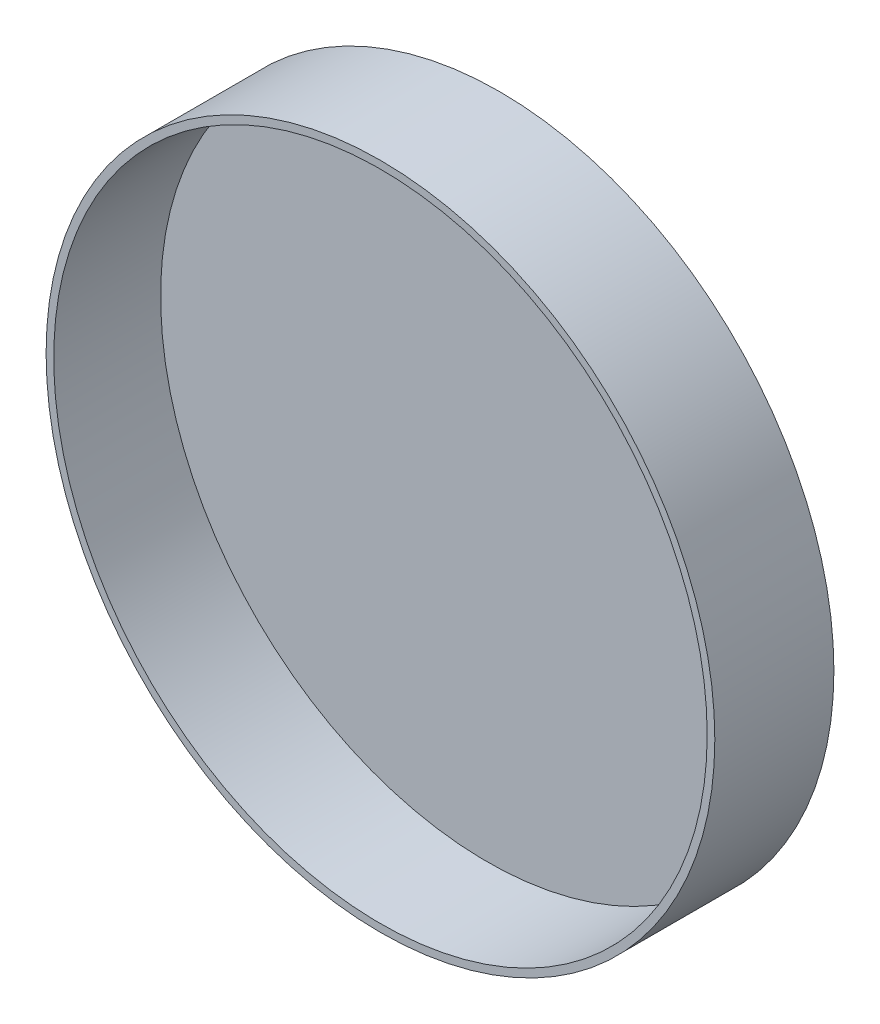
ISO-10303-21;
HEADER;
FILE_DESCRIPTION(('STEP AP214'),'2;1');
FILE_NAME('part.step','',(''),(''),'','','');
FILE_SCHEMA(('AUTOMOTIVE_DESIGN { 1 0 10303 214 1 1 1 1 }'));
ENDSEC;
DATA;
#1=APPLICATION_CONTEXT('core data for automotive mechanical design processes');
#2=APPLICATION_PROTOCOL_DEFINITION('international standard','automotive_design',2000,#1);
#3=PRODUCT_CONTEXT('',#1,'mechanical');
#4=PRODUCT('Part','Part','',(#3));
#5=PRODUCT_RELATED_PRODUCT_CATEGORY('part','',(#4));
#6=PRODUCT_DEFINITION_FORMATION('','',#4);
#7=PRODUCT_DEFINITION_CONTEXT('part definition',#1,'design');
#8=PRODUCT_DEFINITION('design','',#6,#7);
#9=PRODUCT_DEFINITION_SHAPE('','',#8);
#10=(LENGTH_UNIT() NAMED_UNIT(*) SI_UNIT(.MILLI.,.METRE.));
#11=(NAMED_UNIT(*) PLANE_ANGLE_UNIT() SI_UNIT($,.RADIAN.));
#12=(NAMED_UNIT(*) SI_UNIT($,.STERADIAN.) SOLID_ANGLE_UNIT());
#13=UNCERTAINTY_MEASURE_WITH_UNIT(LENGTH_MEASURE(1.E-05),#10,'distance_accuracy_value','');
#14=(GEOMETRIC_REPRESENTATION_CONTEXT(3) GLOBAL_UNCERTAINTY_ASSIGNED_CONTEXT((#13)) GLOBAL_UNIT_ASSIGNED_CONTEXT((#10,
#11,#12)) REPRESENTATION_CONTEXT('',''));
#15=CARTESIAN_POINT('',(0.,0.,0.));
#16=DIRECTION('',(0.,0.,1.));
#17=DIRECTION('',(1.,0.,0.));
#18=AXIS2_PLACEMENT_3D('',#15,#16,#17);
#19=CARTESIAN_POINT('',(0.,0.,0.8));
#20=DIRECTION('',(0.,0.,-1.));
#21=DIRECTION('',(-1.,0.,0.));
#22=AXIS2_PLACEMENT_3D('',#19,#20,#21);
#23=CYLINDRICAL_SURFACE('',#22,21.9);
#24=CARTESIAN_POINT('',(0.,0.,0.));
#25=DIRECTION('',(0.,0.,1.));
#26=DIRECTION('',(1.,0.,0.));
#27=AXIS2_PLACEMENT_3D('',#24,#25,#26);
#28=CIRCLE('',#27,21.9);
#29=CARTESIAN_POINT('',(21.9,0.,0.));
#30=VERTEX_POINT('',#29);
#31=EDGE_CURVE('E36',#30,#30,#28,.T.);
#32=ORIENTED_EDGE('',*,*,#31,.T.);
#33=EDGE_LOOP('',(#32));
#34=FACE_BOUND('',#33,.T.);
#35=CARTESIAN_POINT('',(0.,0.,7.8));
#36=DIRECTION('',(0.,0.,1.));
#37=DIRECTION('',(1.,0.,0.));
#38=AXIS2_PLACEMENT_3D('',#35,#36,#37);
#39=CIRCLE('',#38,21.9);
#40=CARTESIAN_POINT('',(21.9,0.,7.8));
#41=VERTEX_POINT('',#40);
#42=EDGE_CURVE('E40',#41,#41,#39,.T.);
#43=ORIENTED_EDGE('',*,*,#42,.F.);
#44=EDGE_LOOP('',(#43));
#45=FACE_BOUND('',#44,.T.);
#46=ADVANCED_FACE('F30',(#34,#45),#23,.T.);
#47=CARTESIAN_POINT('',(0.,0.,0.));
#48=DIRECTION('',(0.,0.,1.));
#49=DIRECTION('',(1.,0.,0.));
#50=AXIS2_PLACEMENT_3D('',#47,#48,#49);
#51=PLANE('',#50);
#52=CARTESIAN_POINT('',(0.,0.,0.));
#53=DIRECTION('',(0.,0.,1.));
#54=DIRECTION('',(1.,0.,0.));
#55=AXIS2_PLACEMENT_3D('',#52,#53,#54);
#56=CIRCLE('',#55,2.);
#57=CARTESIAN_POINT('',(2.,0.,0.));
#58=VERTEX_POINT('',#57);
#59=EDGE_CURVE('E49',#58,#58,#56,.T.);
#60=ORIENTED_EDGE('',*,*,#59,.T.);
#61=EDGE_LOOP('',(#60));
#62=FACE_BOUND('',#61,.T.);
#63=ORIENTED_EDGE('',*,*,#31,.F.);
#64=EDGE_LOOP('',(#63));
#65=FACE_BOUND('',#64,.T.);
#66=ADVANCED_FACE('F68',(#62,#65),#51,.F.);
#67=CARTESIAN_POINT('',(0.,0.,7.8));
#68=DIRECTION('',(0.,0.,1.));
#69=DIRECTION('',(1.,0.,0.));
#70=AXIS2_PLACEMENT_3D('',#67,#68,#69);
#71=PLANE('',#70);
#72=ORIENTED_EDGE('',*,*,#42,.T.);
#73=EDGE_LOOP('',(#72));
#74=FACE_BOUND('',#73,.T.);
#75=CARTESIAN_POINT('',(0.,0.,7.8));
#76=DIRECTION('',(0.,0.,1.));
#77=DIRECTION('',(1.,0.,0.));
#78=AXIS2_PLACEMENT_3D('',#75,#76,#77);
#79=CIRCLE('',#78,21.4);
#80=CARTESIAN_POINT('',(21.4,0.,7.8));
#81=VERTEX_POINT('',#80);
#82=EDGE_CURVE('E44',#81,#81,#79,.T.);
#83=ORIENTED_EDGE('',*,*,#82,.F.);
#84=EDGE_LOOP('',(#83));
#85=FACE_BOUND('',#84,.T.);
#86=ADVANCED_FACE('F72',(#74,#85),#71,.T.);
#87=CARTESIAN_POINT('',(0.,0.,7.8));
#88=DIRECTION('',(0.,0.,-1.));
#89=DIRECTION('',(-1.,0.,0.));
#90=AXIS2_PLACEMENT_3D('',#87,#88,#89);
#91=CYLINDRICAL_SURFACE('',#90,21.4);
#92=ORIENTED_EDGE('',*,*,#82,.T.);
#93=EDGE_LOOP('',(#92));
#94=FACE_BOUND('',#93,.T.);
#95=CARTESIAN_POINT('',(0.,0.,0.8));
#96=DIRECTION('',(0.,0.,1.));
#97=DIRECTION('',(1.,0.,0.));
#98=AXIS2_PLACEMENT_3D('',#95,#96,#97);
#99=CIRCLE('',#98,21.4);
#100=CARTESIAN_POINT('',(21.4,0.,0.8));
#101=VERTEX_POINT('',#100);
#102=EDGE_CURVE('E10',#101,#101,#99,.F.);
#103=ORIENTED_EDGE('',*,*,#102,.T.);
#104=EDGE_LOOP('',(#103));
#105=FACE_BOUND('',#104,.T.);
#106=ADVANCED_FACE('F79',(#94,#105),#91,.F.);
#107=CARTESIAN_POINT('',(0.,0.,0.8));
#108=DIRECTION('',(0.,0.,1.));
#109=DIRECTION('',(1.,0.,0.));
#110=AXIS2_PLACEMENT_3D('',#107,#108,#109);
#111=PLANE('',#110);
#112=ORIENTED_EDGE('',*,*,#102,.F.);
#113=EDGE_LOOP('',(#112));
#114=FACE_BOUND('',#113,.T.);
#115=ADVANCED_FACE('F65',(#114),#111,.T.);
#116=CARTESIAN_POINT('',(0.,0.,-9.2));
#117=DIRECTION('',(0.,0.,1.));
#118=DIRECTION('',(1.,0.,0.));
#119=AXIS2_PLACEMENT_3D('',#116,#117,#118);
#120=CYLINDRICAL_SURFACE('',#119,2.);
#121=CARTESIAN_POINT('',(0.,0.,-9.2));
#122=DIRECTION('',(0.,0.,1.));
#123=DIRECTION('',(1.,0.,0.));
#124=AXIS2_PLACEMENT_3D('',#121,#122,#123);
#125=CIRCLE('',#124,2.);
#126=CARTESIAN_POINT('',(2.,0.,-9.2));
#127=VERTEX_POINT('',#126);
#128=EDGE_CURVE('E52',#127,#127,#125,.T.);
#129=ORIENTED_EDGE('',*,*,#128,.T.);
#130=EDGE_LOOP('',(#129));
#131=FACE_BOUND('',#130,.T.);
#132=ORIENTED_EDGE('',*,*,#59,.F.);
#133=EDGE_LOOP('',(#132));
#134=FACE_BOUND('',#133,.T.);
#135=ADVANCED_FACE('F56',(#131,#134),#120,.T.);
#136=CARTESIAN_POINT('',(0.,0.,-9.2));
#137=DIRECTION('',(0.,0.,1.));
#138=DIRECTION('',(1.,0.,0.));
#139=AXIS2_PLACEMENT_3D('',#136,#137,#138);
#140=PLANE('',#139);
#141=ORIENTED_EDGE('',*,*,#128,.F.);
#142=EDGE_LOOP('',(#141));
#143=FACE_BOUND('',#142,.T.);
#144=ADVANCED_FACE('F59',(#143),#140,.F.);
#145=CLOSED_SHELL('',(#46,#66,#86,#106,#115,#135,#144));
#146=MANIFOLD_SOLID_BREP('B2',#145);
#147=ADVANCED_BREP_SHAPE_REPRESENTATION('',(#18,#146),#14);
#148=SHAPE_DEFINITION_REPRESENTATION(#9,#147);
ENDSEC;
END-ISO-10303-21;
